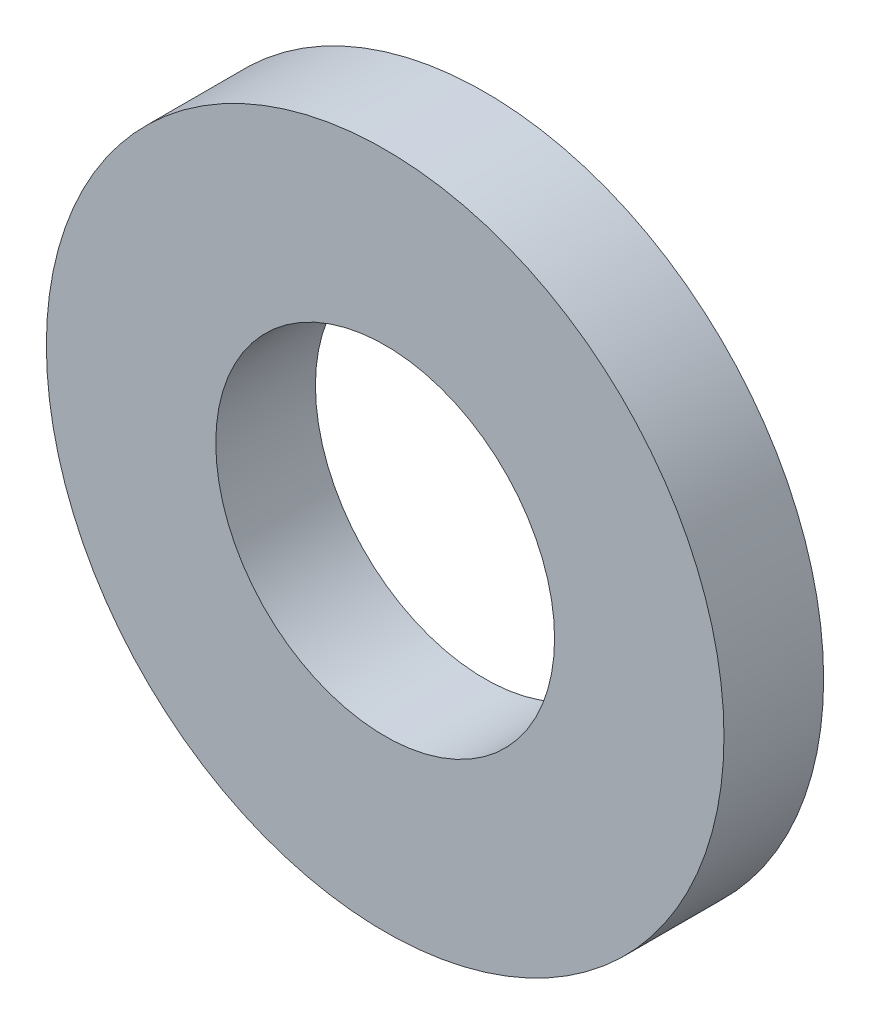
ISO-10303-21;
HEADER;
FILE_DESCRIPTION(('STEP AP214'),'2;1');
FILE_NAME('part.step','',(''),(''),'','','');
FILE_SCHEMA(('AUTOMOTIVE_DESIGN { 1 0 10303 214 1 1 1 1 }'));
ENDSEC;
DATA;
#1=APPLICATION_CONTEXT('core data for automotive mechanical design processes');
#2=APPLICATION_PROTOCOL_DEFINITION('international standard','automotive_design',2000,#1);
#3=PRODUCT_CONTEXT('',#1,'mechanical');
#4=PRODUCT('Part','Part','',(#3));
#5=PRODUCT_RELATED_PRODUCT_CATEGORY('part','',(#4));
#6=PRODUCT_DEFINITION_FORMATION('','',#4);
#7=PRODUCT_DEFINITION_CONTEXT('part definition',#1,'design');
#8=PRODUCT_DEFINITION('design','',#6,#7);
#9=PRODUCT_DEFINITION_SHAPE('','',#8);
#10=(LENGTH_UNIT() NAMED_UNIT(*) SI_UNIT(.MILLI.,.METRE.));
#11=(NAMED_UNIT(*) PLANE_ANGLE_UNIT() SI_UNIT($,.RADIAN.));
#12=(NAMED_UNIT(*) SI_UNIT($,.STERADIAN.) SOLID_ANGLE_UNIT());
#13=UNCERTAINTY_MEASURE_WITH_UNIT(LENGTH_MEASURE(1.E-05),#10,'distance_accuracy_value','');
#14=(GEOMETRIC_REPRESENTATION_CONTEXT(3) GLOBAL_UNCERTAINTY_ASSIGNED_CONTEXT((#13)) GLOBAL_UNIT_ASSIGNED_CONTEXT((#10,
#11,#12)) REPRESENTATION_CONTEXT('',''));
#15=CARTESIAN_POINT('',(0.,0.,0.));
#16=DIRECTION('',(0.,0.,1.));
#17=DIRECTION('',(1.,0.,0.));
#18=AXIS2_PLACEMENT_3D('',#15,#16,#17);
#19=CARTESIAN_POINT('',(0.,0.,10.));
#20=DIRECTION('',(0.,0.,1.));
#21=DIRECTION('',(1.,0.,0.));
#22=AXIS2_PLACEMENT_3D('',#19,#20,#21);
#23=PLANE('',#22);
#24=CARTESIAN_POINT('',(0.,0.,10.));
#25=DIRECTION('',(0.,0.,1.));
#26=DIRECTION('',(1.,0.,0.));
#27=AXIS2_PLACEMENT_3D('',#24,#25,#26);
#28=CIRCLE('',#27,34.);
#29=CARTESIAN_POINT('',(34.,0.,10.));
#30=VERTEX_POINT('',#29);
#31=EDGE_CURVE('E10',#30,#30,#28,.T.);
#32=ORIENTED_EDGE('',*,*,#31,.T.);
#33=EDGE_LOOP('',(#32));
#34=FACE_BOUND('',#33,.T.);
#35=CARTESIAN_POINT('',(0.,0.,10.));
#36=DIRECTION('',(0.,0.,1.));
#37=DIRECTION('',(1.,0.,0.));
#38=AXIS2_PLACEMENT_3D('',#35,#36,#37);
#39=CIRCLE('',#38,17.);
#40=CARTESIAN_POINT('',(17.,0.,10.));
#41=VERTEX_POINT('',#40);
#42=EDGE_CURVE('E42',#41,#41,#39,.T.);
#43=ORIENTED_EDGE('',*,*,#42,.F.);
#44=EDGE_LOOP('',(#43));
#45=FACE_BOUND('',#44,.T.);
#46=ADVANCED_FACE('F31',(#34,#45),#23,.T.);
#47=CARTESIAN_POINT('',(0.,0.,0.));
#48=DIRECTION('',(0.,0.,1.));
#49=DIRECTION('',(1.,0.,0.));
#50=AXIS2_PLACEMENT_3D('',#47,#48,#49);
#51=PLANE('',#50);
#52=CARTESIAN_POINT('',(0.,0.,0.));
#53=DIRECTION('',(0.,0.,1.));
#54=DIRECTION('',(1.,0.,0.));
#55=AXIS2_PLACEMENT_3D('',#52,#53,#54);
#56=CIRCLE('',#55,34.);
#57=CARTESIAN_POINT('',(34.,0.,0.));
#58=VERTEX_POINT('',#57);
#59=EDGE_CURVE('E35',#58,#58,#56,.T.);
#60=ORIENTED_EDGE('',*,*,#59,.F.);
#61=EDGE_LOOP('',(#60));
#62=FACE_BOUND('',#61,.T.);
#63=CARTESIAN_POINT('',(0.,0.,0.));
#64=DIRECTION('',(0.,0.,1.));
#65=DIRECTION('',(1.,0.,0.));
#66=AXIS2_PLACEMENT_3D('',#63,#64,#65);
#67=CIRCLE('',#66,17.);
#68=CARTESIAN_POINT('',(17.,0.,0.));
#69=VERTEX_POINT('',#68);
#70=EDGE_CURVE('E44',#69,#69,#67,.T.);
#71=ORIENTED_EDGE('',*,*,#70,.T.);
#72=EDGE_LOOP('',(#71));
#73=FACE_BOUND('',#72,.T.);
#74=ADVANCED_FACE('F54',(#62,#73),#51,.F.);
#75=CARTESIAN_POINT('',(0.,0.,10.));
#76=DIRECTION('',(0.,0.,-1.));
#77=DIRECTION('',(-1.,0.,0.));
#78=AXIS2_PLACEMENT_3D('',#75,#76,#77);
#79=CYLINDRICAL_SURFACE('',#78,34.);
#80=ORIENTED_EDGE('',*,*,#31,.F.);
#81=EDGE_LOOP('',(#80));
#82=FACE_BOUND('',#81,.T.);
#83=ORIENTED_EDGE('',*,*,#59,.T.);
#84=EDGE_LOOP('',(#83));
#85=FACE_BOUND('',#84,.T.);
#86=ADVANCED_FACE('F33',(#82,#85),#79,.T.);
#87=CARTESIAN_POINT('',(0.,0.,10.));
#88=DIRECTION('',(0.,0.,-1.));
#89=DIRECTION('',(-1.,0.,0.));
#90=AXIS2_PLACEMENT_3D('',#87,#88,#89);
#91=CYLINDRICAL_SURFACE('',#90,17.);
#92=ORIENTED_EDGE('',*,*,#42,.T.);
#93=EDGE_LOOP('',(#92));
#94=FACE_BOUND('',#93,.T.);
#95=ORIENTED_EDGE('',*,*,#70,.F.);
#96=EDGE_LOOP('',(#95));
#97=FACE_BOUND('',#96,.T.);
#98=ADVANCED_FACE('F50',(#94,#97),#91,.F.);
#99=CLOSED_SHELL('',(#46,#74,#86,#98));
#100=MANIFOLD_SOLID_BREP('B2',#99);
#101=ADVANCED_BREP_SHAPE_REPRESENTATION('',(#18,#100),#14);
#102=SHAPE_DEFINITION_REPRESENTATION(#9,#101);
ENDSEC;
END-ISO-10303-21;
